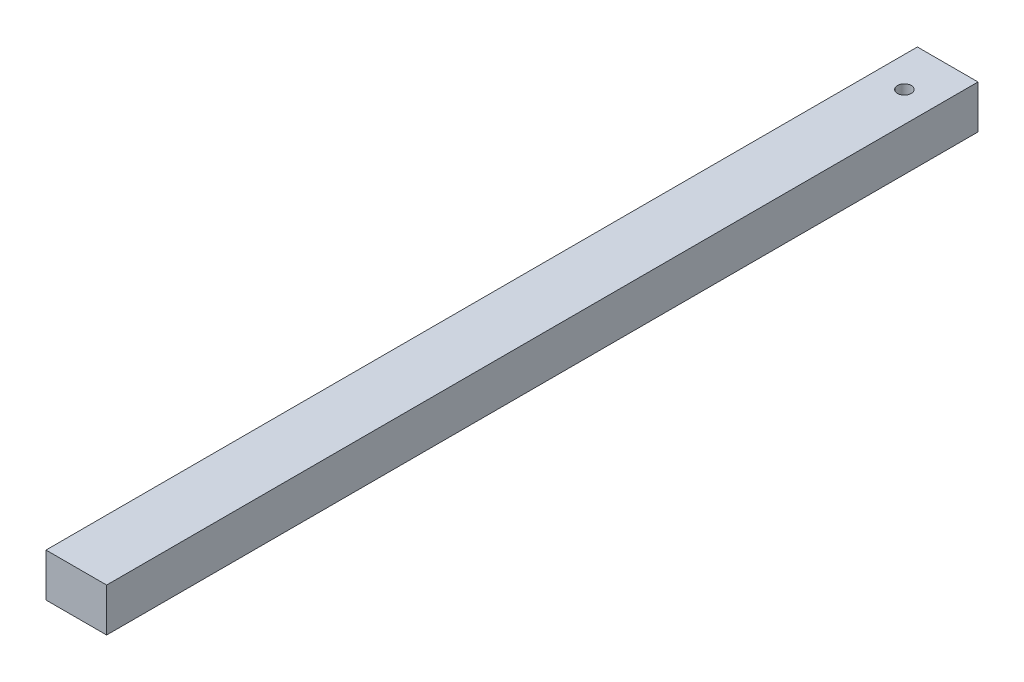
ISO-10303-21;
HEADER;
FILE_DESCRIPTION(('STEP AP214'),'2;1');
FILE_NAME('part.step','',(''),(''),'','','');
FILE_SCHEMA(('AUTOMOTIVE_DESIGN { 1 0 10303 214 1 1 1 1 }'));
ENDSEC;
DATA;
#1=APPLICATION_CONTEXT('core data for automotive mechanical design processes');
#2=APPLICATION_PROTOCOL_DEFINITION('international standard','automotive_design',2000,#1);
#3=PRODUCT_CONTEXT('',#1,'mechanical');
#4=PRODUCT('Part','Part','',(#3));
#5=PRODUCT_RELATED_PRODUCT_CATEGORY('part','',(#4));
#6=PRODUCT_DEFINITION_FORMATION('','',#4);
#7=PRODUCT_DEFINITION_CONTEXT('part definition',#1,'design');
#8=PRODUCT_DEFINITION('design','',#6,#7);
#9=PRODUCT_DEFINITION_SHAPE('','',#8);
#10=(LENGTH_UNIT() NAMED_UNIT(*) SI_UNIT(.MILLI.,.METRE.));
#11=(NAMED_UNIT(*) PLANE_ANGLE_UNIT() SI_UNIT($,.RADIAN.));
#12=(NAMED_UNIT(*) SI_UNIT($,.STERADIAN.) SOLID_ANGLE_UNIT());
#13=UNCERTAINTY_MEASURE_WITH_UNIT(LENGTH_MEASURE(1.E-05),#10,'distance_accuracy_value','');
#14=(GEOMETRIC_REPRESENTATION_CONTEXT(3) GLOBAL_UNCERTAINTY_ASSIGNED_CONTEXT((#13)) GLOBAL_UNIT_ASSIGNED_CONTEXT((#10,
#11,#12)) REPRESENTATION_CONTEXT('',''));
#15=CARTESIAN_POINT('',(0.,0.,0.));
#16=DIRECTION('',(0.,0.,1.));
#17=DIRECTION('',(1.,0.,0.));
#18=AXIS2_PLACEMENT_3D('',#15,#16,#17);
#19=CARTESIAN_POINT('',(17.5,12.5,503.));
#20=DIRECTION('',(-1.,0.,0.));
#21=DIRECTION('',(0.,-1.,0.));
#22=AXIS2_PLACEMENT_3D('',#19,#20,#21);
#23=PLANE('',#22);
#24=DIRECTION('',(0.,1.,0.));
#25=VECTOR('',#24,1.);
#26=CARTESIAN_POINT('',(17.5,12.5,0.));
#27=LINE('',#26,#25);
#28=CARTESIAN_POINT('',(17.5,-12.5,0.));
#29=VERTEX_POINT('',#28);
#30=CARTESIAN_POINT('',(17.5,12.5,0.));
#31=VERTEX_POINT('',#30);
#32=EDGE_CURVE('E98',#29,#31,#27,.T.);
#33=ORIENTED_EDGE('',*,*,#32,.T.);
#34=DIRECTION('',(0.,0.,-1.));
#35=VECTOR('',#34,1.);
#36=CARTESIAN_POINT('',(17.5,12.5,503.));
#37=LINE('',#36,#35);
#38=CARTESIAN_POINT('',(17.5,12.5,503.));
#39=VERTEX_POINT('',#38);
#40=EDGE_CURVE('E11',#39,#31,#37,.T.);
#41=ORIENTED_EDGE('',*,*,#40,.F.);
#42=DIRECTION('',(0.,1.,0.));
#43=VECTOR('',#42,1.);
#44=CARTESIAN_POINT('',(17.5,12.5,503.));
#45=LINE('',#44,#43);
#46=CARTESIAN_POINT('',(17.5,-12.5,503.));
#47=VERTEX_POINT('',#46);
#48=EDGE_CURVE('E86',#47,#39,#45,.T.);
#49=ORIENTED_EDGE('',*,*,#48,.F.);
#50=DIRECTION('',(0.,0.,-1.));
#51=VECTOR('',#50,1.);
#52=CARTESIAN_POINT('',(17.5,-12.5,503.));
#53=LINE('',#52,#51);
#54=EDGE_CURVE('E94',#47,#29,#53,.T.);
#55=ORIENTED_EDGE('',*,*,#54,.T.);
#56=EDGE_LOOP('',(#33,#41,#49,#55));
#57=FACE_BOUND('',#56,.T.);
#58=ADVANCED_FACE('F35',(#57),#23,.F.);
#59=CARTESIAN_POINT('',(-17.5,12.5,503.));
#60=DIRECTION('',(0.,-1.,0.));
#61=DIRECTION('',(0.,0.,-1.));
#62=AXIS2_PLACEMENT_3D('',#59,#60,#61);
#63=PLANE('',#62);
#64=CARTESIAN_POINT('',(0.,12.5,25.));
#65=DIRECTION('',(0.,1.,0.));
#66=DIRECTION('',(0.,0.,1.));
#67=AXIS2_PLACEMENT_3D('',#64,#65,#66);
#68=CIRCLE('',#67,4.);
#69=CARTESIAN_POINT('',(0.,12.5,29.));
#70=VERTEX_POINT('',#69);
#71=EDGE_CURVE('E112',#70,#70,#68,.T.);
#72=ORIENTED_EDGE('',*,*,#71,.F.);
#73=EDGE_LOOP('',(#72));
#74=FACE_BOUND('',#73,.T.);
#75=DIRECTION('',(-1.,0.,0.));
#76=VECTOR('',#75,1.);
#77=CARTESIAN_POINT('',(-17.5,12.5,0.));
#78=LINE('',#77,#76);
#79=CARTESIAN_POINT('',(-17.5,12.5,0.));
#80=VERTEX_POINT('',#79);
#81=EDGE_CURVE('E90',#31,#80,#78,.T.);
#82=ORIENTED_EDGE('',*,*,#81,.T.);
#83=DIRECTION('',(0.,0.,-1.));
#84=VECTOR('',#83,1.);
#85=CARTESIAN_POINT('',(-17.5,12.5,503.));
#86=LINE('',#85,#84);
#87=CARTESIAN_POINT('',(-17.5,12.5,503.));
#88=VERTEX_POINT('',#87);
#89=EDGE_CURVE('E43',#88,#80,#86,.T.);
#90=ORIENTED_EDGE('',*,*,#89,.F.);
#91=DIRECTION('',(-1.,0.,0.));
#92=VECTOR('',#91,1.);
#93=CARTESIAN_POINT('',(-17.5,12.5,503.));
#94=LINE('',#93,#92);
#95=EDGE_CURVE('E81',#39,#88,#94,.T.);
#96=ORIENTED_EDGE('',*,*,#95,.F.);
#97=ORIENTED_EDGE('',*,*,#40,.T.);
#98=EDGE_LOOP('',(#82,#90,#96,#97));
#99=FACE_BOUND('',#98,.T.);
#100=ADVANCED_FACE('F89',(#74,#99),#63,.F.);
#101=CARTESIAN_POINT('',(-17.5,12.5,503.));
#102=DIRECTION('',(1.,0.,0.));
#103=DIRECTION('',(0.,1.,0.));
#104=AXIS2_PLACEMENT_3D('',#101,#102,#103);
#105=PLANE('',#104);
#106=DIRECTION('',(0.,-1.,0.));
#107=VECTOR('',#106,1.);
#108=CARTESIAN_POINT('',(-17.5,12.5,0.));
#109=LINE('',#108,#107);
#110=CARTESIAN_POINT('',(-17.5,-12.5,0.));
#111=VERTEX_POINT('',#110);
#112=EDGE_CURVE('E68',#80,#111,#109,.T.);
#113=ORIENTED_EDGE('',*,*,#112,.T.);
#114=DIRECTION('',(0.,0.,-1.));
#115=VECTOR('',#114,1.);
#116=CARTESIAN_POINT('',(-17.5,-12.5,503.));
#117=LINE('',#116,#115);
#118=CARTESIAN_POINT('',(-17.5,-12.5,503.));
#119=VERTEX_POINT('',#118);
#120=EDGE_CURVE('E91',#119,#111,#117,.T.);
#121=ORIENTED_EDGE('',*,*,#120,.F.);
#122=DIRECTION('',(0.,-1.,0.));
#123=VECTOR('',#122,1.);
#124=CARTESIAN_POINT('',(-17.5,12.5,503.));
#125=LINE('',#124,#123);
#126=EDGE_CURVE('E84',#88,#119,#125,.T.);
#127=ORIENTED_EDGE('',*,*,#126,.F.);
#128=ORIENTED_EDGE('',*,*,#89,.T.);
#129=EDGE_LOOP('',(#113,#121,#127,#128));
#130=FACE_BOUND('',#129,.T.);
#131=ADVANCED_FACE('F92',(#130),#105,.F.);
#132=CARTESIAN_POINT('',(-17.5,-12.5,503.));
#133=DIRECTION('',(0.,1.,0.));
#134=DIRECTION('',(0.,0.,1.));
#135=AXIS2_PLACEMENT_3D('',#132,#133,#134);
#136=PLANE('',#135);
#137=CARTESIAN_POINT('',(0.,-12.5,25.));
#138=DIRECTION('',(0.,1.,0.));
#139=DIRECTION('',(0.,0.,1.));
#140=AXIS2_PLACEMENT_3D('',#137,#138,#139);
#141=CIRCLE('',#140,4.);
#142=CARTESIAN_POINT('',(0.,-12.5,29.));
#143=VERTEX_POINT('',#142);
#144=EDGE_CURVE('E101',#143,#143,#141,.T.);
#145=ORIENTED_EDGE('',*,*,#144,.T.);
#146=EDGE_LOOP('',(#145));
#147=FACE_BOUND('',#146,.T.);
#148=DIRECTION('',(1.,0.,0.));
#149=VECTOR('',#148,1.);
#150=CARTESIAN_POINT('',(-17.5,-12.5,0.));
#151=LINE('',#150,#149);
#152=EDGE_CURVE('E74',#111,#29,#151,.T.);
#153=ORIENTED_EDGE('',*,*,#152,.T.);
#154=ORIENTED_EDGE('',*,*,#54,.F.);
#155=DIRECTION('',(1.,0.,0.));
#156=VECTOR('',#155,1.);
#157=CARTESIAN_POINT('',(-17.5,-12.5,503.));
#158=LINE('',#157,#156);
#159=EDGE_CURVE('E51',#119,#47,#158,.T.);
#160=ORIENTED_EDGE('',*,*,#159,.F.);
#161=ORIENTED_EDGE('',*,*,#120,.T.);
#162=EDGE_LOOP('',(#153,#154,#160,#161));
#163=FACE_BOUND('',#162,.T.);
#164=ADVANCED_FACE('F106',(#147,#163),#136,.F.);
#165=CARTESIAN_POINT('',(0.,0.,503.));
#166=DIRECTION('',(0.,0.,1.));
#167=DIRECTION('',(1.,0.,0.));
#168=AXIS2_PLACEMENT_3D('',#165,#166,#167);
#169=PLANE('',#168);
#170=ORIENTED_EDGE('',*,*,#48,.T.);
#171=ORIENTED_EDGE('',*,*,#95,.T.);
#172=ORIENTED_EDGE('',*,*,#126,.T.);
#173=ORIENTED_EDGE('',*,*,#159,.T.);
#174=EDGE_LOOP('',(#170,#171,#172,#173));
#175=FACE_BOUND('',#174,.T.);
#176=ADVANCED_FACE('F82',(#175),#169,.T.);
#177=CARTESIAN_POINT('',(0.,0.,0.));
#178=DIRECTION('',(0.,0.,1.));
#179=DIRECTION('',(1.,0.,0.));
#180=AXIS2_PLACEMENT_3D('',#177,#178,#179);
#181=PLANE('',#180);
#182=ORIENTED_EDGE('',*,*,#32,.F.);
#183=ORIENTED_EDGE('',*,*,#152,.F.);
#184=ORIENTED_EDGE('',*,*,#112,.F.);
#185=ORIENTED_EDGE('',*,*,#81,.F.);
#186=EDGE_LOOP('',(#182,#183,#184,#185));
#187=FACE_BOUND('',#186,.T.);
#188=ADVANCED_FACE('F109',(#187),#181,.F.);
#189=CARTESIAN_POINT('',(0.,-12.5,25.));
#190=DIRECTION('',(0.,1.,0.));
#191=DIRECTION('',(0.,0.,1.));
#192=AXIS2_PLACEMENT_3D('',#189,#190,#191);
#193=CYLINDRICAL_SURFACE('',#192,4.);
#194=ORIENTED_EDGE('',*,*,#144,.F.);
#195=EDGE_LOOP('',(#194));
#196=FACE_BOUND('',#195,.T.);
#197=ORIENTED_EDGE('',*,*,#71,.T.);
#198=EDGE_LOOP('',(#197));
#199=FACE_BOUND('',#198,.T.);
#200=ADVANCED_FACE('F119',(#196,#199),#193,.F.);
#201=CLOSED_SHELL('',(#58,#100,#131,#164,#176,#188,#200));
#202=MANIFOLD_SOLID_BREP('B2',#201);
#203=ADVANCED_BREP_SHAPE_REPRESENTATION('',(#18,#202),#14);
#204=SHAPE_DEFINITION_REPRESENTATION(#9,#203);
ENDSEC;
END-ISO-10303-21;
